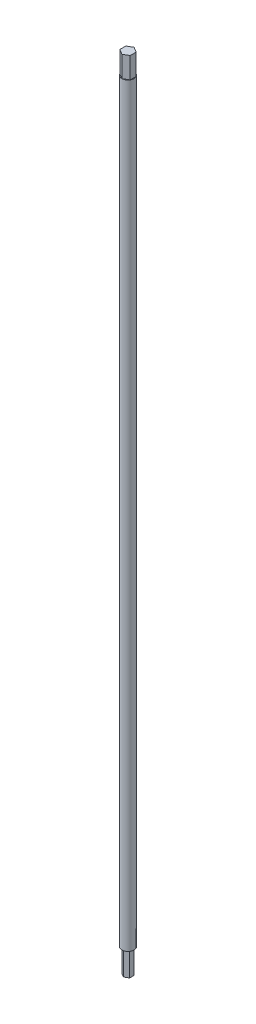
ISO-10303-21;
HEADER;
FILE_DESCRIPTION(('STEP AP214'),'2;1');
FILE_NAME('part.step','',(''),(''),'','','');
FILE_SCHEMA(('AUTOMOTIVE_DESIGN { 1 0 10303 214 1 1 1 1 }'));
ENDSEC;
DATA;
#1=APPLICATION_CONTEXT('core data for automotive mechanical design processes');
#2=APPLICATION_PROTOCOL_DEFINITION('international standard','automotive_design',2000,#1);
#3=PRODUCT_CONTEXT('',#1,'mechanical');
#4=PRODUCT('Part','Part','',(#3));
#5=PRODUCT_RELATED_PRODUCT_CATEGORY('part','',(#4));
#6=PRODUCT_DEFINITION_FORMATION('','',#4);
#7=PRODUCT_DEFINITION_CONTEXT('part definition',#1,'design');
#8=PRODUCT_DEFINITION('design','',#6,#7);
#9=PRODUCT_DEFINITION_SHAPE('','',#8);
#10=(LENGTH_UNIT() NAMED_UNIT(*) SI_UNIT(.MILLI.,.METRE.));
#11=(NAMED_UNIT(*) PLANE_ANGLE_UNIT() SI_UNIT($,.RADIAN.));
#12=(NAMED_UNIT(*) SI_UNIT($,.STERADIAN.) SOLID_ANGLE_UNIT());
#13=UNCERTAINTY_MEASURE_WITH_UNIT(LENGTH_MEASURE(1.E-05),#10,'distance_accuracy_value','');
#14=(GEOMETRIC_REPRESENTATION_CONTEXT(3) GLOBAL_UNCERTAINTY_ASSIGNED_CONTEXT((#13)) GLOBAL_UNIT_ASSIGNED_CONTEXT((#10,
#11,#12)) REPRESENTATION_CONTEXT('',''));
#15=CARTESIAN_POINT('',(0.,0.,0.));
#16=DIRECTION('',(0.,0.,1.));
#17=DIRECTION('',(1.,0.,0.));
#18=AXIS2_PLACEMENT_3D('',#15,#16,#17);
#19=CARTESIAN_POINT('',(0.,250.,0.));
#20=DIRECTION('',(0.,1.,0.));
#21=DIRECTION('',(0.,0.,1.));
#22=AXIS2_PLACEMENT_3D('',#19,#20,#21);
#23=PLANE('',#22);
#24=DIRECTION('',(-0.866025403784441,0.,-0.499999999999995));
#25=VECTOR('',#24,1.);
#26=CARTESIAN_POINT('',(1.73205080756887,250.,-1.00000000000002));
#27=LINE('',#26,#25);
#28=CARTESIAN_POINT('',(1.73205080756887,250.,-1.00000000000002));
#29=VERTEX_POINT('',#28);
#30=CARTESIAN_POINT('',(0.,250.,-2.));
#31=VERTEX_POINT('',#30);
#32=EDGE_CURVE('E157',#29,#31,#27,.T.);
#33=ORIENTED_EDGE('',*,*,#32,.F.);
#34=CARTESIAN_POINT('',(0.,250.,0.));
#35=DIRECTION('',(0.,1.,0.));
#36=DIRECTION('',(0.,0.,1.));
#37=AXIS2_PLACEMENT_3D('',#34,#35,#36);
#38=CIRCLE('',#37,2.);
#39=EDGE_CURVE('E248',#29,#31,#38,.T.);
#40=ORIENTED_EDGE('',*,*,#39,.T.);
#41=EDGE_LOOP('',(#33,#40));
#42=FACE_BOUND('',#41,.T.);
#43=ADVANCED_FACE('F39',(#42),#23,.T.);
#44=DIRECTION('',(0.,0.,-1.));
#45=VECTOR('',#44,1.);
#46=CARTESIAN_POINT('',(1.73205080756889,250.,0.999999999999984));
#47=LINE('',#46,#45);
#48=CARTESIAN_POINT('',(1.73205080756889,250.,0.999999999999983));
#49=VERTEX_POINT('',#48);
#50=EDGE_CURVE('E154',#49,#29,#47,.T.);
#51=ORIENTED_EDGE('',*,*,#50,.F.);
#52=EDGE_CURVE('E49',#49,#29,#38,.T.);
#53=ORIENTED_EDGE('',*,*,#52,.T.);
#54=EDGE_LOOP('',(#51,#53));
#55=FACE_BOUND('',#54,.T.);
#56=ADVANCED_FACE('F258',(#55),#23,.T.);
#57=DIRECTION('',(0.866025403784434,0.,-0.500000000000007));
#58=VECTOR('',#57,1.);
#59=CARTESIAN_POINT('',(0.,250.,2.));
#60=LINE('',#59,#58);
#61=CARTESIAN_POINT('',(0.,250.,2.));
#62=VERTEX_POINT('',#61);
#63=EDGE_CURVE('E267',#62,#49,#60,.T.);
#64=ORIENTED_EDGE('',*,*,#63,.F.);
#65=EDGE_CURVE('E11',#62,#49,#38,.T.);
#66=ORIENTED_EDGE('',*,*,#65,.T.);
#67=EDGE_LOOP('',(#64,#66));
#68=FACE_BOUND('',#67,.T.);
#69=ADVANCED_FACE('F305',(#68),#23,.T.);
#70=DIRECTION('',(0.866025403784442,0.,0.499999999999995));
#71=VECTOR('',#70,1.);
#72=CARTESIAN_POINT('',(-1.73205080756887,250.,1.00000000000001));
#73=LINE('',#72,#71);
#74=CARTESIAN_POINT('',(-1.73205080756887,250.,1.00000000000001));
#75=VERTEX_POINT('',#74);
#76=EDGE_CURVE('E56',#75,#62,#73,.T.);
#77=ORIENTED_EDGE('',*,*,#76,.F.);
#78=EDGE_CURVE('E50',#75,#62,#38,.T.);
#79=ORIENTED_EDGE('',*,*,#78,.T.);
#80=EDGE_LOOP('',(#77,#79));
#81=FACE_BOUND('',#80,.T.);
#82=ADVANCED_FACE('F434',(#81),#23,.T.);
#83=DIRECTION('',(0.,0.,1.));
#84=VECTOR('',#83,1.);
#85=CARTESIAN_POINT('',(-1.73205080756888,250.,-0.999999999999996));
#86=LINE('',#85,#84);
#87=CARTESIAN_POINT('',(-1.73205080756888,250.,-0.999999999999996));
#88=VERTEX_POINT('',#87);
#89=EDGE_CURVE('E291',#88,#75,#86,.T.);
#90=ORIENTED_EDGE('',*,*,#89,.F.);
#91=EDGE_CURVE('E238',#88,#75,#38,.T.);
#92=ORIENTED_EDGE('',*,*,#91,.T.);
#93=EDGE_LOOP('',(#90,#92));
#94=FACE_BOUND('',#93,.T.);
#95=ADVANCED_FACE('F315',(#94),#23,.T.);
#96=CARTESIAN_POINT('',(0.,0.,0.));
#97=DIRECTION('',(0.,1.,0.));
#98=DIRECTION('',(0.,0.,1.));
#99=AXIS2_PLACEMENT_3D('',#96,#97,#98);
#100=PLANE('',#99);
#101=CARTESIAN_POINT('',(0.,0.,0.));
#102=DIRECTION('',(0.,1.,0.));
#103=DIRECTION('',(0.,0.,1.));
#104=AXIS2_PLACEMENT_3D('',#101,#102,#103);
#105=CIRCLE('',#104,2.);
#106=CARTESIAN_POINT('',(0.,0.,2.));
#107=VERTEX_POINT('',#106);
#108=EDGE_CURVE('E43',#107,#107,#105,.T.);
#109=ORIENTED_EDGE('',*,*,#108,.F.);
#110=EDGE_LOOP('',(#109));
#111=FACE_BOUND('',#110,.T.);
#112=DIRECTION('',(-0.866025403784439,0.,0.5));
#113=VECTOR('',#112,1.);
#114=CARTESIAN_POINT('',(1.29903810567666,0.,0.750000000000001));
#115=LINE('',#114,#113);
#116=CARTESIAN_POINT('',(1.29903810567666,0.,0.750000000000001));
#117=VERTEX_POINT('',#116);
#118=CARTESIAN_POINT('',(0.,0.,1.5));
#119=VERTEX_POINT('',#118);
#120=EDGE_CURVE('E159',#117,#119,#115,.T.);
#121=ORIENTED_EDGE('',*,*,#120,.F.);
#122=DIRECTION('',(0.,0.,1.));
#123=VECTOR('',#122,1.);
#124=CARTESIAN_POINT('',(1.29903810567666,0.,-0.75));
#125=LINE('',#124,#123);
#126=CARTESIAN_POINT('',(1.29903810567666,0.,-0.75));
#127=VERTEX_POINT('',#126);
#128=EDGE_CURVE('E175',#127,#117,#125,.T.);
#129=ORIENTED_EDGE('',*,*,#128,.F.);
#130=DIRECTION('',(0.866025403784439,0.,0.5));
#131=VECTOR('',#130,1.);
#132=CARTESIAN_POINT('',(0.,0.,-1.5));
#133=LINE('',#132,#131);
#134=CARTESIAN_POINT('',(0.,0.,-1.5));
#135=VERTEX_POINT('',#134);
#136=EDGE_CURVE('E202',#135,#127,#133,.T.);
#137=ORIENTED_EDGE('',*,*,#136,.F.);
#138=DIRECTION('',(0.866025403784439,0.,-0.5));
#139=VECTOR('',#138,1.);
#140=CARTESIAN_POINT('',(-1.29903810567666,0.,-0.75));
#141=LINE('',#140,#139);
#142=CARTESIAN_POINT('',(-1.29903810567666,0.,-0.75));
#143=VERTEX_POINT('',#142);
#144=EDGE_CURVE('E198',#143,#135,#141,.T.);
#145=ORIENTED_EDGE('',*,*,#144,.F.);
#146=DIRECTION('',(0.,0.,-1.));
#147=VECTOR('',#146,1.);
#148=CARTESIAN_POINT('',(-1.29903810567666,0.,0.75));
#149=LINE('',#148,#147);
#150=CARTESIAN_POINT('',(-1.29903810567666,0.,0.75));
#151=VERTEX_POINT('',#150);
#152=EDGE_CURVE('E194',#151,#143,#149,.T.);
#153=ORIENTED_EDGE('',*,*,#152,.F.);
#154=DIRECTION('',(-0.866025403784439,0.,-0.5));
#155=VECTOR('',#154,1.);
#156=CARTESIAN_POINT('',(0.,0.,1.5));
#157=LINE('',#156,#155);
#158=EDGE_CURVE('E164',#119,#151,#157,.T.);
#159=ORIENTED_EDGE('',*,*,#158,.F.);
#160=EDGE_LOOP('',(#121,#129,#137,#145,#153,#159));
#161=FACE_BOUND('',#160,.T.);
#162=ADVANCED_FACE('F308',(#111,#161),#100,.F.);
#163=CARTESIAN_POINT('',(0.,250.,0.));
#164=DIRECTION('',(0.,-1.,0.));
#165=DIRECTION('',(0.,0.,-1.));
#166=AXIS2_PLACEMENT_3D('',#163,#164,#165);
#167=CYLINDRICAL_SURFACE('',#166,2.);
#168=ORIENTED_EDGE('',*,*,#65,.F.);
#169=ORIENTED_EDGE('',*,*,#78,.F.);
#170=ORIENTED_EDGE('',*,*,#91,.F.);
#171=EDGE_CURVE('E242',#31,#88,#38,.T.);
#172=ORIENTED_EDGE('',*,*,#171,.F.);
#173=ORIENTED_EDGE('',*,*,#39,.F.);
#174=ORIENTED_EDGE('',*,*,#52,.F.);
#175=EDGE_LOOP('',(#168,#169,#170,#172,#173,#174));
#176=FACE_BOUND('',#175,.T.);
#177=ORIENTED_EDGE('',*,*,#108,.T.);
#178=EDGE_LOOP('',(#177));
#179=FACE_BOUND('',#178,.T.);
#180=ADVANCED_FACE('F41',(#176,#179),#167,.T.);
#181=DIRECTION('',(-0.866025403784438,0.,0.500000000000001));
#182=VECTOR('',#181,1.);
#183=CARTESIAN_POINT('',(0.,250.,-2.));
#184=LINE('',#183,#182);
#185=EDGE_CURVE('E63',#31,#88,#184,.T.);
#186=ORIENTED_EDGE('',*,*,#185,.F.);
#187=ORIENTED_EDGE('',*,*,#171,.T.);
#188=EDGE_LOOP('',(#186,#187));
#189=FACE_BOUND('',#188,.T.);
#190=ADVANCED_FACE('F307',(#189),#23,.T.);
#191=CARTESIAN_POINT('',(1.29903810567666,-8.,0.750000000000001));
#192=DIRECTION('',(-0.5,0.,-0.866025403784439));
#193=DIRECTION('',(-0.866025403784439,0.,0.5));
#194=AXIS2_PLACEMENT_3D('',#191,#192,#193);
#195=PLANE('',#194);
#196=ORIENTED_EDGE('',*,*,#120,.T.);
#197=DIRECTION('',(0.,1.,0.));
#198=VECTOR('',#197,1.);
#199=CARTESIAN_POINT('',(0.,-8.,1.5));
#200=LINE('',#199,#198);
#201=CARTESIAN_POINT('',(0.,-8.,1.5));
#202=VERTEX_POINT('',#201);
#203=EDGE_CURVE('E228',#202,#119,#200,.T.);
#204=ORIENTED_EDGE('',*,*,#203,.F.);
#205=DIRECTION('',(-0.866025403784439,0.,0.5));
#206=VECTOR('',#205,1.);
#207=CARTESIAN_POINT('',(1.29903810567666,-8.,0.750000000000001));
#208=LINE('',#207,#206);
#209=CARTESIAN_POINT('',(1.29903810567666,-8.,0.750000000000001));
#210=VERTEX_POINT('',#209);
#211=EDGE_CURVE('E170',#210,#202,#208,.T.);
#212=ORIENTED_EDGE('',*,*,#211,.F.);
#213=DIRECTION('',(0.,1.,0.));
#214=VECTOR('',#213,1.);
#215=CARTESIAN_POINT('',(1.29903810567666,-8.,0.750000000000001));
#216=LINE('',#215,#214);
#217=EDGE_CURVE('E189',#210,#117,#216,.T.);
#218=ORIENTED_EDGE('',*,*,#217,.T.);
#219=EDGE_LOOP('',(#196,#204,#212,#218));
#220=FACE_BOUND('',#219,.T.);
#221=ADVANCED_FACE('F313',(#220),#195,.F.);
#222=CARTESIAN_POINT('',(0.,-8.,1.5));
#223=DIRECTION('',(0.5,0.,-0.866025403784439));
#224=DIRECTION('',(-0.866025403784439,0.,-0.5));
#225=AXIS2_PLACEMENT_3D('',#222,#223,#224);
#226=PLANE('',#225);
#227=ORIENTED_EDGE('',*,*,#158,.T.);
#228=DIRECTION('',(0.,1.,0.));
#229=VECTOR('',#228,1.);
#230=CARTESIAN_POINT('',(-1.29903810567666,-8.,0.75));
#231=LINE('',#230,#229);
#232=CARTESIAN_POINT('',(-1.29903810567666,-8.,0.75));
#233=VERTEX_POINT('',#232);
#234=EDGE_CURVE('E224',#233,#151,#231,.T.);
#235=ORIENTED_EDGE('',*,*,#234,.F.);
#236=DIRECTION('',(-0.866025403784439,0.,-0.5));
#237=VECTOR('',#236,1.);
#238=CARTESIAN_POINT('',(0.,-8.,1.5));
#239=LINE('',#238,#237);
#240=EDGE_CURVE('E174',#202,#233,#239,.T.);
#241=ORIENTED_EDGE('',*,*,#240,.F.);
#242=ORIENTED_EDGE('',*,*,#203,.T.);
#243=EDGE_LOOP('',(#227,#235,#241,#242));
#244=FACE_BOUND('',#243,.T.);
#245=ADVANCED_FACE('F324',(#244),#226,.F.);
#246=CARTESIAN_POINT('',(-1.29903810567666,-8.,0.75));
#247=DIRECTION('',(1.,0.,0.));
#248=DIRECTION('',(0.,0.,-1.));
#249=AXIS2_PLACEMENT_3D('',#246,#247,#248);
#250=PLANE('',#249);
#251=ORIENTED_EDGE('',*,*,#152,.T.);
#252=DIRECTION('',(0.,1.,0.));
#253=VECTOR('',#252,1.);
#254=CARTESIAN_POINT('',(-1.29903810567666,-8.,-0.75));
#255=LINE('',#254,#253);
#256=CARTESIAN_POINT('',(-1.29903810567666,-8.,-0.75));
#257=VERTEX_POINT('',#256);
#258=EDGE_CURVE('E220',#257,#143,#255,.T.);
#259=ORIENTED_EDGE('',*,*,#258,.F.);
#260=DIRECTION('',(0.,0.,-1.));
#261=VECTOR('',#260,1.);
#262=CARTESIAN_POINT('',(-1.29903810567666,-8.,0.75));
#263=LINE('',#262,#261);
#264=EDGE_CURVE('E178',#233,#257,#263,.T.);
#265=ORIENTED_EDGE('',*,*,#264,.F.);
#266=ORIENTED_EDGE('',*,*,#234,.T.);
#267=EDGE_LOOP('',(#251,#259,#265,#266));
#268=FACE_BOUND('',#267,.T.);
#269=ADVANCED_FACE('F328',(#268),#250,.F.);
#270=CARTESIAN_POINT('',(-1.29903810567666,-8.,-0.75));
#271=DIRECTION('',(0.5,0.,0.866025403784439));
#272=DIRECTION('',(0.866025403784439,0.,-0.5));
#273=AXIS2_PLACEMENT_3D('',#270,#271,#272);
#274=PLANE('',#273);
#275=ORIENTED_EDGE('',*,*,#144,.T.);
#276=DIRECTION('',(0.,1.,0.));
#277=VECTOR('',#276,1.);
#278=CARTESIAN_POINT('',(0.,-8.,-1.5));
#279=LINE('',#278,#277);
#280=CARTESIAN_POINT('',(0.,-8.,-1.5));
#281=VERTEX_POINT('',#280);
#282=EDGE_CURVE('E216',#281,#135,#279,.T.);
#283=ORIENTED_EDGE('',*,*,#282,.F.);
#284=DIRECTION('',(0.866025403784439,0.,-0.5));
#285=VECTOR('',#284,1.);
#286=CARTESIAN_POINT('',(-1.29903810567666,-8.,-0.75));
#287=LINE('',#286,#285);
#288=EDGE_CURVE('E181',#257,#281,#287,.T.);
#289=ORIENTED_EDGE('',*,*,#288,.F.);
#290=ORIENTED_EDGE('',*,*,#258,.T.);
#291=EDGE_LOOP('',(#275,#283,#289,#290));
#292=FACE_BOUND('',#291,.T.);
#293=ADVANCED_FACE('F331',(#292),#274,.F.);
#294=CARTESIAN_POINT('',(0.,-8.,-1.5));
#295=DIRECTION('',(-0.5,0.,0.866025403784439));
#296=DIRECTION('',(0.866025403784439,0.,0.5));
#297=AXIS2_PLACEMENT_3D('',#294,#295,#296);
#298=PLANE('',#297);
#299=ORIENTED_EDGE('',*,*,#136,.T.);
#300=DIRECTION('',(0.,1.,0.));
#301=VECTOR('',#300,1.);
#302=CARTESIAN_POINT('',(1.29903810567666,-8.,-0.75));
#303=LINE('',#302,#301);
#304=CARTESIAN_POINT('',(1.29903810567666,-8.,-0.75));
#305=VERTEX_POINT('',#304);
#306=EDGE_CURVE('E212',#305,#127,#303,.T.);
#307=ORIENTED_EDGE('',*,*,#306,.F.);
#308=DIRECTION('',(0.866025403784439,0.,0.5));
#309=VECTOR('',#308,1.);
#310=CARTESIAN_POINT('',(0.,-8.,-1.5));
#311=LINE('',#310,#309);
#312=EDGE_CURVE('E184',#281,#305,#311,.T.);
#313=ORIENTED_EDGE('',*,*,#312,.F.);
#314=ORIENTED_EDGE('',*,*,#282,.T.);
#315=EDGE_LOOP('',(#299,#307,#313,#314));
#316=FACE_BOUND('',#315,.T.);
#317=ADVANCED_FACE('F335',(#316),#298,.F.);
#318=CARTESIAN_POINT('',(1.29903810567666,-8.,-0.75));
#319=DIRECTION('',(-1.,0.,0.));
#320=DIRECTION('',(0.,0.,1.));
#321=AXIS2_PLACEMENT_3D('',#318,#319,#320);
#322=PLANE('',#321);
#323=ORIENTED_EDGE('',*,*,#128,.T.);
#324=ORIENTED_EDGE('',*,*,#217,.F.);
#325=DIRECTION('',(0.,0.,1.));
#326=VECTOR('',#325,1.);
#327=CARTESIAN_POINT('',(1.29903810567666,-8.,-0.75));
#328=LINE('',#327,#326);
#329=EDGE_CURVE('E187',#305,#210,#328,.T.);
#330=ORIENTED_EDGE('',*,*,#329,.F.);
#331=ORIENTED_EDGE('',*,*,#306,.T.);
#332=EDGE_LOOP('',(#323,#324,#330,#331));
#333=FACE_BOUND('',#332,.T.);
#334=ADVANCED_FACE('F339',(#333),#322,.F.);
#335=CARTESIAN_POINT('',(0.,-8.,0.));
#336=DIRECTION('',(0.,-1.,0.));
#337=DIRECTION('',(0.,0.,-1.));
#338=AXIS2_PLACEMENT_3D('',#335,#336,#337);
#339=PLANE('',#338);
#340=ORIENTED_EDGE('',*,*,#211,.T.);
#341=ORIENTED_EDGE('',*,*,#240,.T.);
#342=ORIENTED_EDGE('',*,*,#264,.T.);
#343=ORIENTED_EDGE('',*,*,#288,.T.);
#344=ORIENTED_EDGE('',*,*,#312,.T.);
#345=ORIENTED_EDGE('',*,*,#329,.T.);
#346=EDGE_LOOP('',(#340,#341,#342,#343,#344,#345));
#347=FACE_BOUND('',#346,.T.);
#348=ADVANCED_FACE('F343',(#347),#339,.T.);
#349=CARTESIAN_POINT('',(1.73205080756887,257.,-1.00000000000002));
#350=DIRECTION('',(-0.499999999999995,0.,0.866025403784441));
#351=DIRECTION('',(0.866025403784441,0.,0.499999999999995));
#352=AXIS2_PLACEMENT_3D('',#349,#350,#351);
#353=PLANE('',#352);
#354=ORIENTED_EDGE('',*,*,#32,.T.);
#355=DIRECTION('',(0.,-1.,0.));
#356=VECTOR('',#355,1.);
#357=CARTESIAN_POINT('',(0.,257.,-2.));
#358=LINE('',#357,#356);
#359=CARTESIAN_POINT('',(0.,257.,-2.));
#360=VERTEX_POINT('',#359);
#361=EDGE_CURVE('E136',#360,#31,#358,.T.);
#362=ORIENTED_EDGE('',*,*,#361,.F.);
#363=DIRECTION('',(-0.866025403784441,0.,-0.499999999999995));
#364=VECTOR('',#363,1.);
#365=CARTESIAN_POINT('',(1.73205080756887,257.,-1.00000000000002));
#366=LINE('',#365,#364);
#367=CARTESIAN_POINT('',(1.73205080756887,257.,-1.00000000000002));
#368=VERTEX_POINT('',#367);
#369=EDGE_CURVE('E144',#368,#360,#366,.T.);
#370=ORIENTED_EDGE('',*,*,#369,.F.);
#371=DIRECTION('',(0.,-1.,0.));
#372=VECTOR('',#371,1.);
#373=CARTESIAN_POINT('',(1.73205080756887,257.,-1.00000000000002));
#374=LINE('',#373,#372);
#375=EDGE_CURVE('E263',#368,#29,#374,.T.);
#376=ORIENTED_EDGE('',*,*,#375,.T.);
#377=EDGE_LOOP('',(#354,#362,#370,#376));
#378=FACE_BOUND('',#377,.T.);
#379=ADVANCED_FACE('F156',(#378),#353,.F.);
#380=CARTESIAN_POINT('',(0.,257.,-2.));
#381=DIRECTION('',(0.500000000000001,0.,0.866025403784438));
#382=DIRECTION('',(0.866025403784438,0.,-0.500000000000001));
#383=AXIS2_PLACEMENT_3D('',#380,#381,#382);
#384=PLANE('',#383);
#385=ORIENTED_EDGE('',*,*,#185,.T.);
#386=DIRECTION('',(0.,-1.,0.));
#387=VECTOR('',#386,1.);
#388=CARTESIAN_POINT('',(-1.73205080756888,257.,-0.999999999999996));
#389=LINE('',#388,#387);
#390=CARTESIAN_POINT('',(-1.73205080756888,257.,-0.999999999999996));
#391=VERTEX_POINT('',#390);
#392=EDGE_CURVE('E139',#391,#88,#389,.T.);
#393=ORIENTED_EDGE('',*,*,#392,.F.);
#394=DIRECTION('',(-0.866025403784438,0.,0.500000000000001));
#395=VECTOR('',#394,1.);
#396=CARTESIAN_POINT('',(0.,257.,-2.));
#397=LINE('',#396,#395);
#398=EDGE_CURVE('E132',#360,#391,#397,.T.);
#399=ORIENTED_EDGE('',*,*,#398,.F.);
#400=ORIENTED_EDGE('',*,*,#361,.T.);
#401=EDGE_LOOP('',(#385,#393,#399,#400));
#402=FACE_BOUND('',#401,.T.);
#403=ADVANCED_FACE('F134',(#402),#384,.F.);
#404=CARTESIAN_POINT('',(-1.73205080756888,257.,-0.999999999999996));
#405=DIRECTION('',(1.,0.,0.));
#406=DIRECTION('',(0.,0.,-1.));
#407=AXIS2_PLACEMENT_3D('',#404,#405,#406);
#408=PLANE('',#407);
#409=ORIENTED_EDGE('',*,*,#89,.T.);
#410=DIRECTION('',(0.,-1.,0.));
#411=VECTOR('',#410,1.);
#412=CARTESIAN_POINT('',(-1.73205080756887,257.,1.00000000000001));
#413=LINE('',#412,#411);
#414=CARTESIAN_POINT('',(-1.73205080756887,257.,1.00000000000001));
#415=VERTEX_POINT('',#414);
#416=EDGE_CURVE('E166',#415,#75,#413,.T.);
#417=ORIENTED_EDGE('',*,*,#416,.F.);
#418=DIRECTION('',(0.,0.,1.));
#419=VECTOR('',#418,1.);
#420=CARTESIAN_POINT('',(-1.73205080756888,257.,-0.999999999999996));
#421=LINE('',#420,#419);
#422=EDGE_CURVE('E143',#391,#415,#421,.T.);
#423=ORIENTED_EDGE('',*,*,#422,.F.);
#424=ORIENTED_EDGE('',*,*,#392,.T.);
#425=EDGE_LOOP('',(#409,#417,#423,#424));
#426=FACE_BOUND('',#425,.T.);
#427=ADVANCED_FACE('F290',(#426),#408,.F.);
#428=CARTESIAN_POINT('',(-1.73205080756887,257.,1.00000000000001));
#429=DIRECTION('',(0.499999999999995,0.,-0.866025403784442));
#430=DIRECTION('',(-0.866025403784442,0.,-0.499999999999995));
#431=AXIS2_PLACEMENT_3D('',#428,#429,#430);
#432=PLANE('',#431);
#433=ORIENTED_EDGE('',*,*,#76,.T.);
#434=DIRECTION('',(0.,-1.,0.));
#435=VECTOR('',#434,1.);
#436=CARTESIAN_POINT('',(0.,257.,2.));
#437=LINE('',#436,#435);
#438=CARTESIAN_POINT('',(0.,257.,2.));
#439=VERTEX_POINT('',#438);
#440=EDGE_CURVE('E273',#439,#62,#437,.T.);
#441=ORIENTED_EDGE('',*,*,#440,.F.);
#442=DIRECTION('',(0.866025403784442,0.,0.499999999999995));
#443=VECTOR('',#442,1.);
#444=CARTESIAN_POINT('',(-1.73205080756887,257.,1.00000000000001));
#445=LINE('',#444,#443);
#446=EDGE_CURVE('E288',#415,#439,#445,.T.);
#447=ORIENTED_EDGE('',*,*,#446,.F.);
#448=ORIENTED_EDGE('',*,*,#416,.T.);
#449=EDGE_LOOP('',(#433,#441,#447,#448));
#450=FACE_BOUND('',#449,.T.);
#451=ADVANCED_FACE('F286',(#450),#432,.F.);
#452=CARTESIAN_POINT('',(0.,257.,2.));
#453=DIRECTION('',(-0.500000000000007,0.,-0.866025403784434));
#454=DIRECTION('',(-0.866025403784435,0.,0.500000000000007));
#455=AXIS2_PLACEMENT_3D('',#452,#453,#454);
#456=PLANE('',#455);
#457=ORIENTED_EDGE('',*,*,#63,.T.);
#458=DIRECTION('',(0.,-1.,0.));
#459=VECTOR('',#458,1.);
#460=CARTESIAN_POINT('',(1.73205080756889,257.,0.999999999999984));
#461=LINE('',#460,#459);
#462=CARTESIAN_POINT('',(1.73205080756889,257.,0.999999999999984));
#463=VERTEX_POINT('',#462);
#464=EDGE_CURVE('E265',#463,#49,#461,.T.);
#465=ORIENTED_EDGE('',*,*,#464,.F.);
#466=DIRECTION('',(0.866025403784434,0.,-0.500000000000007));
#467=VECTOR('',#466,1.);
#468=CARTESIAN_POINT('',(0.,257.,2.));
#469=LINE('',#468,#467);
#470=EDGE_CURVE('E275',#439,#463,#469,.T.);
#471=ORIENTED_EDGE('',*,*,#470,.F.);
#472=ORIENTED_EDGE('',*,*,#440,.T.);
#473=EDGE_LOOP('',(#457,#465,#471,#472));
#474=FACE_BOUND('',#473,.T.);
#475=ADVANCED_FACE('F302',(#474),#456,.F.);
#476=CARTESIAN_POINT('',(1.73205080756889,257.,0.999999999999984));
#477=DIRECTION('',(-1.,0.,0.));
#478=DIRECTION('',(0.,0.,1.));
#479=AXIS2_PLACEMENT_3D('',#476,#477,#478);
#480=PLANE('',#479);
#481=ORIENTED_EDGE('',*,*,#50,.T.);
#482=ORIENTED_EDGE('',*,*,#375,.F.);
#483=DIRECTION('',(0.,0.,-1.));
#484=VECTOR('',#483,1.);
#485=CARTESIAN_POINT('',(1.73205080756889,257.,0.999999999999984));
#486=LINE('',#485,#484);
#487=EDGE_CURVE('E149',#463,#368,#486,.T.);
#488=ORIENTED_EDGE('',*,*,#487,.F.);
#489=ORIENTED_EDGE('',*,*,#464,.T.);
#490=EDGE_LOOP('',(#481,#482,#488,#489));
#491=FACE_BOUND('',#490,.T.);
#492=ADVANCED_FACE('F262',(#491),#480,.F.);
#493=CARTESIAN_POINT('',(0.,257.,0.));
#494=DIRECTION('',(0.,1.,0.));
#495=DIRECTION('',(0.,0.,1.));
#496=AXIS2_PLACEMENT_3D('',#493,#494,#495);
#497=PLANE('',#496);
#498=ORIENTED_EDGE('',*,*,#369,.T.);
#499=ORIENTED_EDGE('',*,*,#398,.T.);
#500=ORIENTED_EDGE('',*,*,#422,.T.);
#501=ORIENTED_EDGE('',*,*,#446,.T.);
#502=ORIENTED_EDGE('',*,*,#470,.T.);
#503=ORIENTED_EDGE('',*,*,#487,.T.);
#504=EDGE_LOOP('',(#498,#499,#500,#501,#502,#503));
#505=FACE_BOUND('',#504,.T.);
#506=ADVANCED_FACE('F147',(#505),#497,.T.);
#507=CLOSED_SHELL('',(#43,#56,#69,#82,#95,#162,#180,#190,#221,#245,#269,#293,#317,#334,#348,
#379,#403,#427,#451,#475,#492,#506));
#508=MANIFOLD_SOLID_BREP('B2',#507);
#509=ADVANCED_BREP_SHAPE_REPRESENTATION('',(#18,#508),#14);
#510=SHAPE_DEFINITION_REPRESENTATION(#9,#509);
ENDSEC;
END-ISO-10303-21;
